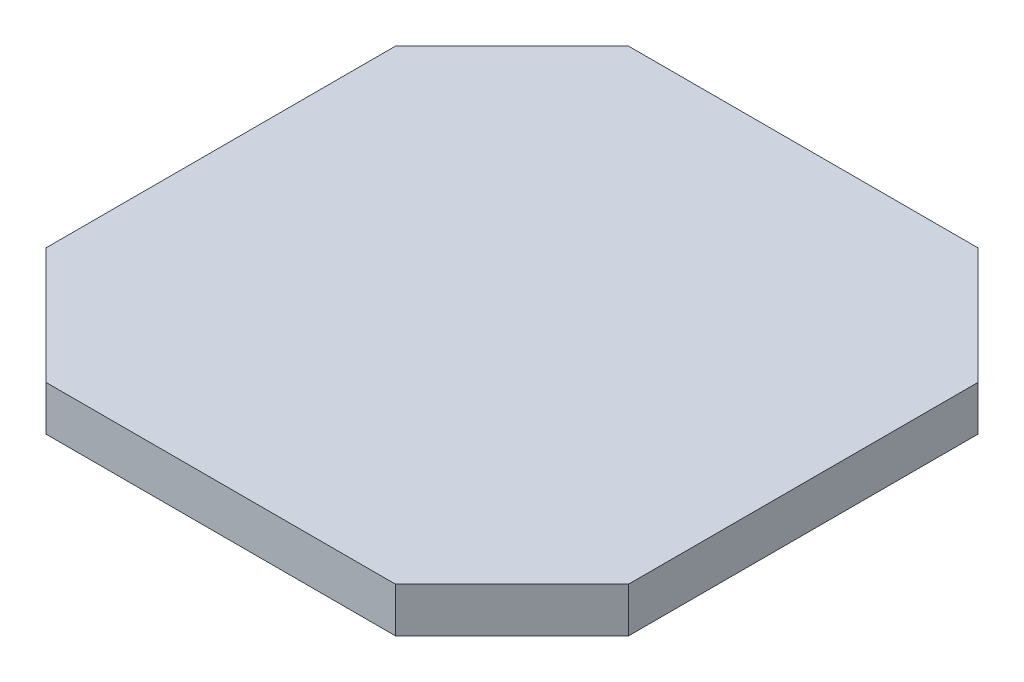
ISO-10303-21;
HEADER;
FILE_DESCRIPTION(('STEP AP214'),'2;1');
FILE_NAME('part.step','',(''),(''),'','','');
FILE_SCHEMA(('AUTOMOTIVE_DESIGN { 1 0 10303 214 1 1 1 1 }'));
ENDSEC;
DATA;
#1=APPLICATION_CONTEXT('core data for automotive mechanical design processes');
#2=APPLICATION_PROTOCOL_DEFINITION('international standard','automotive_design',2000,#1);
#3=PRODUCT_CONTEXT('',#1,'mechanical');
#4=PRODUCT('Part','Part','',(#3));
#5=PRODUCT_RELATED_PRODUCT_CATEGORY('part','',(#4));
#6=PRODUCT_DEFINITION_FORMATION('','',#4);
#7=PRODUCT_DEFINITION_CONTEXT('part definition',#1,'design');
#8=PRODUCT_DEFINITION('design','',#6,#7);
#9=PRODUCT_DEFINITION_SHAPE('','',#8);
#10=(LENGTH_UNIT() NAMED_UNIT(*) SI_UNIT(.MILLI.,.METRE.));
#11=(NAMED_UNIT(*) PLANE_ANGLE_UNIT() SI_UNIT($,.RADIAN.));
#12=(NAMED_UNIT(*) SI_UNIT($,.STERADIAN.) SOLID_ANGLE_UNIT());
#13=UNCERTAINTY_MEASURE_WITH_UNIT(LENGTH_MEASURE(1.E-05),#10,'distance_accuracy_value','');
#14=(GEOMETRIC_REPRESENTATION_CONTEXT(3) GLOBAL_UNCERTAINTY_ASSIGNED_CONTEXT((#13)) GLOBAL_UNIT_ASSIGNED_CONTEXT((#10,
#11,#12)) REPRESENTATION_CONTEXT('',''));
#15=CARTESIAN_POINT('',(0.,0.,0.));
#16=DIRECTION('',(0.,0.,1.));
#17=DIRECTION('',(1.,0.,0.));
#18=AXIS2_PLACEMENT_3D('',#15,#16,#17);
#19=CARTESIAN_POINT('',(-65.0000000000002,10.,38.9999999999998));
#20=DIRECTION('',(1.,0.,0.));
#21=DIRECTION('',(0.,0.,-1.));
#22=AXIS2_PLACEMENT_3D('',#19,#20,#21);
#23=PLANE('',#22);
#24=DIRECTION('',(0.,0.,1.));
#25=VECTOR('',#24,1.);
#26=CARTESIAN_POINT('',(-65.0000000000002,0.,38.9999999999998));
#27=LINE('',#26,#25);
#28=CARTESIAN_POINT('',(-65.0000000000003,0.,-38.9999999999998));
#29=VERTEX_POINT('',#28);
#30=CARTESIAN_POINT('',(-65.0000000000002,0.,38.9999999999998));
#31=VERTEX_POINT('',#30);
#32=EDGE_CURVE('E146',#29,#31,#27,.T.);
#33=ORIENTED_EDGE('',*,*,#32,.T.);
#34=DIRECTION('',(0.,-1.,0.));
#35=VECTOR('',#34,1.);
#36=CARTESIAN_POINT('',(-65.0000000000002,10.,38.9999999999998));
#37=LINE('',#36,#35);
#38=CARTESIAN_POINT('',(-65.0000000000002,10.,38.9999999999998));
#39=VERTEX_POINT('',#38);
#40=EDGE_CURVE('E11',#39,#31,#37,.T.);
#41=ORIENTED_EDGE('',*,*,#40,.F.);
#42=DIRECTION('',(0.,0.,1.));
#43=VECTOR('',#42,1.);
#44=CARTESIAN_POINT('',(-65.0000000000002,10.,38.9999999999998));
#45=LINE('',#44,#43);
#46=CARTESIAN_POINT('',(-65.0000000000003,10.,-38.9999999999998));
#47=VERTEX_POINT('',#46);
#48=EDGE_CURVE('E165',#47,#39,#45,.T.);
#49=ORIENTED_EDGE('',*,*,#48,.F.);
#50=DIRECTION('',(0.,-1.,0.));
#51=VECTOR('',#50,1.);
#52=CARTESIAN_POINT('',(-65.0000000000003,10.,-38.9999999999998));
#53=LINE('',#52,#51);
#54=EDGE_CURVE('E142',#47,#29,#53,.T.);
#55=ORIENTED_EDGE('',*,*,#54,.T.);
#56=EDGE_LOOP('',(#33,#41,#49,#55));
#57=FACE_BOUND('',#56,.T.);
#58=ADVANCED_FACE('F41',(#57),#23,.F.);
#59=CARTESIAN_POINT('',(-38.9999999999997,10.,65.0000000000003));
#60=DIRECTION('',(0.707106781186547,0.,-0.707106781186548));
#61=DIRECTION('',(-0.707106781186548,0.,-0.707106781186547));
#62=AXIS2_PLACEMENT_3D('',#59,#60,#61);
#63=PLANE('',#62);
#64=DIRECTION('',(0.707106781186548,0.,0.707106781186547));
#65=VECTOR('',#64,1.);
#66=CARTESIAN_POINT('',(-38.9999999999997,0.,65.0000000000003));
#67=LINE('',#66,#65);
#68=CARTESIAN_POINT('',(-38.9999999999997,0.,65.0000000000003));
#69=VERTEX_POINT('',#68);
#70=EDGE_CURVE('E149',#31,#69,#67,.T.);
#71=ORIENTED_EDGE('',*,*,#70,.T.);
#72=DIRECTION('',(0.,-1.,0.));
#73=VECTOR('',#72,1.);
#74=CARTESIAN_POINT('',(-38.9999999999997,10.,65.0000000000003));
#75=LINE('',#74,#73);
#76=CARTESIAN_POINT('',(-38.9999999999997,10.,65.0000000000003));
#77=VERTEX_POINT('',#76);
#78=EDGE_CURVE('E49',#77,#69,#75,.T.);
#79=ORIENTED_EDGE('',*,*,#78,.F.);
#80=DIRECTION('',(0.707106781186548,0.,0.707106781186547));
#81=VECTOR('',#80,1.);
#82=CARTESIAN_POINT('',(-38.9999999999997,10.,65.0000000000003));
#83=LINE('',#82,#81);
#84=EDGE_CURVE('E104',#39,#77,#83,.T.);
#85=ORIENTED_EDGE('',*,*,#84,.F.);
#86=ORIENTED_EDGE('',*,*,#40,.T.);
#87=EDGE_LOOP('',(#71,#79,#85,#86));
#88=FACE_BOUND('',#87,.T.);
#89=ADVANCED_FACE('F205',(#88),#63,.F.);
#90=CARTESIAN_POINT('',(38.9999999999998,10.,65.0000000000003));
#91=DIRECTION('',(0.,0.,-1.));
#92=DIRECTION('',(-1.,0.,0.));
#93=AXIS2_PLACEMENT_3D('',#90,#91,#92);
#94=PLANE('',#93);
#95=DIRECTION('',(1.,0.,0.));
#96=VECTOR('',#95,1.);
#97=CARTESIAN_POINT('',(38.9999999999998,0.,65.0000000000003));
#98=LINE('',#97,#96);
#99=CARTESIAN_POINT('',(38.9999999999998,0.,65.0000000000003));
#100=VERTEX_POINT('',#99);
#101=EDGE_CURVE('E151',#69,#100,#98,.T.);
#102=ORIENTED_EDGE('',*,*,#101,.T.);
#103=DIRECTION('',(0.,-1.,0.));
#104=VECTOR('',#103,1.);
#105=CARTESIAN_POINT('',(38.9999999999998,10.,65.0000000000003));
#106=LINE('',#105,#104);
#107=CARTESIAN_POINT('',(38.9999999999998,10.,65.0000000000003));
#108=VERTEX_POINT('',#107);
#109=EDGE_CURVE('E174',#108,#100,#106,.T.);
#110=ORIENTED_EDGE('',*,*,#109,.F.);
#111=DIRECTION('',(1.,0.,0.));
#112=VECTOR('',#111,1.);
#113=CARTESIAN_POINT('',(38.9999999999998,10.,65.0000000000003));
#114=LINE('',#113,#112);
#115=EDGE_CURVE('E182',#77,#108,#114,.T.);
#116=ORIENTED_EDGE('',*,*,#115,.F.);
#117=ORIENTED_EDGE('',*,*,#78,.T.);
#118=EDGE_LOOP('',(#102,#110,#116,#117));
#119=FACE_BOUND('',#118,.T.);
#120=ADVANCED_FACE('F180',(#119),#94,.F.);
#121=CARTESIAN_POINT('',(65.0000000000003,10.,38.9999999999998));
#122=DIRECTION('',(-0.707106781186548,0.,-0.707106781186547));
#123=DIRECTION('',(-0.707106781186547,0.,0.707106781186548));
#124=AXIS2_PLACEMENT_3D('',#121,#122,#123);
#125=PLANE('',#124);
#126=DIRECTION('',(0.707106781186547,0.,-0.707106781186548));
#127=VECTOR('',#126,1.);
#128=CARTESIAN_POINT('',(65.0000000000003,0.,38.9999999999998));
#129=LINE('',#128,#127);
#130=CARTESIAN_POINT('',(65.0000000000003,0.,38.9999999999998));
#131=VERTEX_POINT('',#130);
#132=EDGE_CURVE('E154',#100,#131,#129,.T.);
#133=ORIENTED_EDGE('',*,*,#132,.T.);
#134=DIRECTION('',(0.,-1.,0.));
#135=VECTOR('',#134,1.);
#136=CARTESIAN_POINT('',(65.0000000000003,10.,38.9999999999998));
#137=LINE('',#136,#135);
#138=CARTESIAN_POINT('',(65.0000000000003,10.,38.9999999999998));
#139=VERTEX_POINT('',#138);
#140=EDGE_CURVE('E170',#139,#131,#137,.T.);
#141=ORIENTED_EDGE('',*,*,#140,.F.);
#142=DIRECTION('',(0.707106781186547,0.,-0.707106781186548));
#143=VECTOR('',#142,1.);
#144=CARTESIAN_POINT('',(65.0000000000003,10.,38.9999999999998));
#145=LINE('',#144,#143);
#146=EDGE_CURVE('E195',#108,#139,#145,.T.);
#147=ORIENTED_EDGE('',*,*,#146,.F.);
#148=ORIENTED_EDGE('',*,*,#109,.T.);
#149=EDGE_LOOP('',(#133,#141,#147,#148));
#150=FACE_BOUND('',#149,.T.);
#151=ADVANCED_FACE('F190',(#150),#125,.F.);
#152=CARTESIAN_POINT('',(65.0000000000003,10.,-38.9999999999998));
#153=DIRECTION('',(-1.,0.,0.));
#154=DIRECTION('',(0.,0.,1.));
#155=AXIS2_PLACEMENT_3D('',#152,#153,#154);
#156=PLANE('',#155);
#157=DIRECTION('',(0.,0.,-1.));
#158=VECTOR('',#157,1.);
#159=CARTESIAN_POINT('',(65.0000000000003,0.,-38.9999999999998));
#160=LINE('',#159,#158);
#161=CARTESIAN_POINT('',(65.0000000000003,0.,-38.9999999999998));
#162=VERTEX_POINT('',#161);
#163=EDGE_CURVE('E157',#131,#162,#160,.T.);
#164=ORIENTED_EDGE('',*,*,#163,.T.);
#165=DIRECTION('',(0.,-1.,0.));
#166=VECTOR('',#165,1.);
#167=CARTESIAN_POINT('',(65.0000000000003,10.,-38.9999999999998));
#168=LINE('',#167,#166);
#169=CARTESIAN_POINT('',(65.0000000000003,10.,-38.9999999999998));
#170=VERTEX_POINT('',#169);
#171=EDGE_CURVE('E134',#170,#162,#168,.T.);
#172=ORIENTED_EDGE('',*,*,#171,.F.);
#173=DIRECTION('',(0.,0.,-1.));
#174=VECTOR('',#173,1.);
#175=CARTESIAN_POINT('',(65.0000000000003,10.,-38.9999999999998));
#176=LINE('',#175,#174);
#177=EDGE_CURVE('E124',#139,#170,#176,.T.);
#178=ORIENTED_EDGE('',*,*,#177,.F.);
#179=ORIENTED_EDGE('',*,*,#140,.T.);
#180=EDGE_LOOP('',(#164,#172,#178,#179));
#181=FACE_BOUND('',#180,.T.);
#182=ADVANCED_FACE('F193',(#181),#156,.F.);
#183=CARTESIAN_POINT('',(38.9999999999998,10.,-65.0000000000003));
#184=DIRECTION('',(-0.707106781186547,0.,0.707106781186548));
#185=DIRECTION('',(0.707106781186548,0.,0.707106781186547));
#186=AXIS2_PLACEMENT_3D('',#183,#184,#185);
#187=PLANE('',#186);
#188=DIRECTION('',(-0.707106781186548,0.,-0.707106781186547));
#189=VECTOR('',#188,1.);
#190=CARTESIAN_POINT('',(38.9999999999998,0.,-65.0000000000003));
#191=LINE('',#190,#189);
#192=CARTESIAN_POINT('',(38.9999999999998,0.,-65.0000000000003));
#193=VERTEX_POINT('',#192);
#194=EDGE_CURVE('E133',#162,#193,#191,.T.);
#195=ORIENTED_EDGE('',*,*,#194,.T.);
#196=DIRECTION('',(0.,-1.,0.));
#197=VECTOR('',#196,1.);
#198=CARTESIAN_POINT('',(38.9999999999998,10.,-65.0000000000003));
#199=LINE('',#198,#197);
#200=CARTESIAN_POINT('',(38.9999999999998,10.,-65.0000000000003));
#201=VERTEX_POINT('',#200);
#202=EDGE_CURVE('E130',#201,#193,#199,.T.);
#203=ORIENTED_EDGE('',*,*,#202,.F.);
#204=DIRECTION('',(-0.707106781186548,0.,-0.707106781186547));
#205=VECTOR('',#204,1.);
#206=CARTESIAN_POINT('',(38.9999999999998,10.,-65.0000000000003));
#207=LINE('',#206,#205);
#208=EDGE_CURVE('E118',#170,#201,#207,.T.);
#209=ORIENTED_EDGE('',*,*,#208,.F.);
#210=ORIENTED_EDGE('',*,*,#171,.T.);
#211=EDGE_LOOP('',(#195,#203,#209,#210));
#212=FACE_BOUND('',#211,.T.);
#213=ADVANCED_FACE('F131',(#212),#187,.F.);
#214=CARTESIAN_POINT('',(-38.9999999999998,10.,-65.0000000000003));
#215=DIRECTION('',(0.,0.,1.));
#216=DIRECTION('',(1.,0.,0.));
#217=AXIS2_PLACEMENT_3D('',#214,#215,#216);
#218=PLANE('',#217);
#219=DIRECTION('',(-1.,0.,0.));
#220=VECTOR('',#219,1.);
#221=CARTESIAN_POINT('',(-38.9999999999998,0.,-65.0000000000003));
#222=LINE('',#221,#220);
#223=CARTESIAN_POINT('',(-38.9999999999998,0.,-65.0000000000003));
#224=VERTEX_POINT('',#223);
#225=EDGE_CURVE('E90',#193,#224,#222,.T.);
#226=ORIENTED_EDGE('',*,*,#225,.T.);
#227=DIRECTION('',(0.,-1.,0.));
#228=VECTOR('',#227,1.);
#229=CARTESIAN_POINT('',(-38.9999999999998,10.,-65.0000000000003));
#230=LINE('',#229,#228);
#231=CARTESIAN_POINT('',(-38.9999999999998,10.,-65.0000000000003));
#232=VERTEX_POINT('',#231);
#233=EDGE_CURVE('E135',#232,#224,#230,.T.);
#234=ORIENTED_EDGE('',*,*,#233,.F.);
#235=DIRECTION('',(-1.,0.,0.));
#236=VECTOR('',#235,1.);
#237=CARTESIAN_POINT('',(-38.9999999999998,10.,-65.0000000000003));
#238=LINE('',#237,#236);
#239=EDGE_CURVE('E122',#201,#232,#238,.T.);
#240=ORIENTED_EDGE('',*,*,#239,.F.);
#241=ORIENTED_EDGE('',*,*,#202,.T.);
#242=EDGE_LOOP('',(#226,#234,#240,#241));
#243=FACE_BOUND('',#242,.T.);
#244=ADVANCED_FACE('F137',(#243),#218,.F.);
#245=CARTESIAN_POINT('',(-65.0000000000003,10.,-38.9999999999998));
#246=DIRECTION('',(0.707106781186548,0.,0.707106781186547));
#247=DIRECTION('',(0.707106781186547,0.,-0.707106781186548));
#248=AXIS2_PLACEMENT_3D('',#245,#246,#247);
#249=PLANE('',#248);
#250=DIRECTION('',(-0.707106781186547,0.,0.707106781186548));
#251=VECTOR('',#250,1.);
#252=CARTESIAN_POINT('',(-65.0000000000003,0.,-38.9999999999998));
#253=LINE('',#252,#251);
#254=EDGE_CURVE('E96',#224,#29,#253,.T.);
#255=ORIENTED_EDGE('',*,*,#254,.T.);
#256=ORIENTED_EDGE('',*,*,#54,.F.);
#257=DIRECTION('',(-0.707106781186547,0.,0.707106781186548));
#258=VECTOR('',#257,1.);
#259=CARTESIAN_POINT('',(-65.0000000000003,10.,-38.9999999999998));
#260=LINE('',#259,#258);
#261=EDGE_CURVE('E57',#232,#47,#260,.T.);
#262=ORIENTED_EDGE('',*,*,#261,.F.);
#263=ORIENTED_EDGE('',*,*,#233,.T.);
#264=EDGE_LOOP('',(#255,#256,#262,#263));
#265=FACE_BOUND('',#264,.T.);
#266=ADVANCED_FACE('F221',(#265),#249,.F.);
#267=CARTESIAN_POINT('',(0.,10.,0.));
#268=DIRECTION('',(0.,-1.,0.));
#269=DIRECTION('',(0.,0.,-1.));
#270=AXIS2_PLACEMENT_3D('',#267,#268,#269);
#271=PLANE('',#270);
#272=ORIENTED_EDGE('',*,*,#48,.T.);
#273=ORIENTED_EDGE('',*,*,#84,.T.);
#274=ORIENTED_EDGE('',*,*,#115,.T.);
#275=ORIENTED_EDGE('',*,*,#146,.T.);
#276=ORIENTED_EDGE('',*,*,#177,.T.);
#277=ORIENTED_EDGE('',*,*,#208,.T.);
#278=ORIENTED_EDGE('',*,*,#239,.T.);
#279=ORIENTED_EDGE('',*,*,#261,.T.);
#280=EDGE_LOOP('',(#272,#273,#274,#275,#276,#277,#278,#279));
#281=FACE_BOUND('',#280,.T.);
#282=ADVANCED_FACE('F120',(#281),#271,.F.);
#283=CARTESIAN_POINT('',(0.,0.,0.));
#284=DIRECTION('',(0.,-1.,0.));
#285=DIRECTION('',(0.,0.,-1.));
#286=AXIS2_PLACEMENT_3D('',#283,#284,#285);
#287=PLANE('',#286);
#288=ORIENTED_EDGE('',*,*,#32,.F.);
#289=ORIENTED_EDGE('',*,*,#254,.F.);
#290=ORIENTED_EDGE('',*,*,#225,.F.);
#291=ORIENTED_EDGE('',*,*,#194,.F.);
#292=ORIENTED_EDGE('',*,*,#163,.F.);
#293=ORIENTED_EDGE('',*,*,#132,.F.);
#294=ORIENTED_EDGE('',*,*,#101,.F.);
#295=ORIENTED_EDGE('',*,*,#70,.F.);
#296=EDGE_LOOP('',(#288,#289,#290,#291,#292,#293,#294,#295));
#297=FACE_BOUND('',#296,.T.);
#298=ADVANCED_FACE('F186',(#297),#287,.T.);
#299=CLOSED_SHELL('',(#58,#89,#120,#151,#182,#213,#244,#266,#282,#298));
#300=MANIFOLD_SOLID_BREP('B2',#299);
#301=ADVANCED_BREP_SHAPE_REPRESENTATION('',(#18,#300),#14);
#302=SHAPE_DEFINITION_REPRESENTATION(#9,#301);
ENDSEC;
END-ISO-10303-21;
